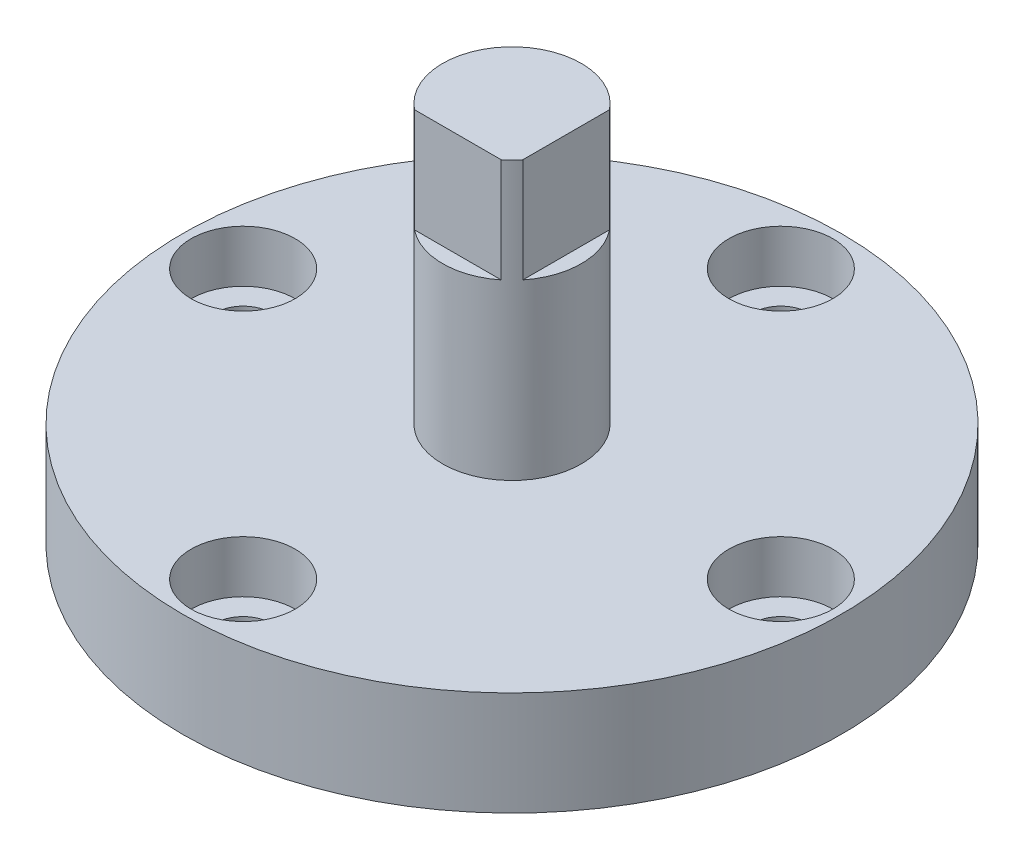
ISO-10303-21;
HEADER;
FILE_DESCRIPTION(('STEP AP214'),'2;1');
FILE_NAME('part.step','',(''),(''),'','','');
FILE_SCHEMA(('AUTOMOTIVE_DESIGN { 1 0 10303 214 1 1 1 1 }'));
ENDSEC;
DATA;
#1=APPLICATION_CONTEXT('core data for automotive mechanical design processes');
#2=APPLICATION_PROTOCOL_DEFINITION('international standard','automotive_design',2000,#1);
#3=PRODUCT_CONTEXT('',#1,'mechanical');
#4=PRODUCT('Part','Part','',(#3));
#5=PRODUCT_RELATED_PRODUCT_CATEGORY('part','',(#4));
#6=PRODUCT_DEFINITION_FORMATION('','',#4);
#7=PRODUCT_DEFINITION_CONTEXT('part definition',#1,'design');
#8=PRODUCT_DEFINITION('design','',#6,#7);
#9=PRODUCT_DEFINITION_SHAPE('','',#8);
#10=(LENGTH_UNIT() NAMED_UNIT(*) SI_UNIT(.MILLI.,.METRE.));
#11=(NAMED_UNIT(*) PLANE_ANGLE_UNIT() SI_UNIT($,.RADIAN.));
#12=(NAMED_UNIT(*) SI_UNIT($,.STERADIAN.) SOLID_ANGLE_UNIT());
#13=UNCERTAINTY_MEASURE_WITH_UNIT(LENGTH_MEASURE(1.E-05),#10,'distance_accuracy_value','');
#14=(GEOMETRIC_REPRESENTATION_CONTEXT(3) GLOBAL_UNCERTAINTY_ASSIGNED_CONTEXT((#13)) GLOBAL_UNIT_ASSIGNED_CONTEXT((#10,
#11,#12)) REPRESENTATION_CONTEXT('',''));
#15=CARTESIAN_POINT('',(0.,0.,0.));
#16=DIRECTION('',(0.,0.,1.));
#17=DIRECTION('',(1.,0.,0.));
#18=AXIS2_PLACEMENT_3D('',#15,#16,#17);
#19=CARTESIAN_POINT('',(0.,3.,0.));
#20=DIRECTION('',(0.,1.,0.));
#21=DIRECTION('',(0.,0.,1.));
#22=AXIS2_PLACEMENT_3D('',#19,#20,#21);
#23=PLANE('',#22);
#24=CARTESIAN_POINT('',(0.,3.,0.));
#25=DIRECTION('',(0.,1.,0.));
#26=DIRECTION('',(0.,0.,1.));
#27=AXIS2_PLACEMENT_3D('',#24,#25,#26);
#28=CIRCLE('',#27,4.);
#29=CARTESIAN_POINT('',(0.,3.,4.));
#30=VERTEX_POINT('',#29);
#31=EDGE_CURVE('E104',#30,#30,#28,.T.);
#32=ORIENTED_EDGE('',*,*,#31,.F.);
#33=EDGE_LOOP('',(#32));
#34=FACE_BOUND('',#33,.T.);
#35=CARTESIAN_POINT('',(0.,3.,15.5));
#36=DIRECTION('',(0.,1.,0.));
#37=DIRECTION('',(0.,0.,1.));
#38=AXIS2_PLACEMENT_3D('',#35,#36,#37);
#39=CIRCLE('',#38,3.);
#40=CARTESIAN_POINT('',(0.,3.,18.5));
#41=VERTEX_POINT('',#40);
#42=EDGE_CURVE('E139',#41,#41,#39,.T.);
#43=ORIENTED_EDGE('',*,*,#42,.F.);
#44=EDGE_LOOP('',(#43));
#45=FACE_BOUND('',#44,.T.);
#46=CARTESIAN_POINT('',(0.,3.,-15.5));
#47=DIRECTION('',(0.,1.,0.));
#48=DIRECTION('',(0.,0.,1.));
#49=AXIS2_PLACEMENT_3D('',#46,#47,#48);
#50=CIRCLE('',#49,3.);
#51=CARTESIAN_POINT('',(0.,3.,-12.5));
#52=VERTEX_POINT('',#51);
#53=EDGE_CURVE('E48',#52,#52,#50,.T.);
#54=ORIENTED_EDGE('',*,*,#53,.F.);
#55=EDGE_LOOP('',(#54));
#56=FACE_BOUND('',#55,.T.);
#57=CARTESIAN_POINT('',(0.,3.,0.));
#58=DIRECTION('',(0.,1.,0.));
#59=DIRECTION('',(0.,0.,1.));
#60=AXIS2_PLACEMENT_3D('',#57,#58,#59);
#61=CIRCLE('',#60,19.);
#62=CARTESIAN_POINT('',(0.,3.,19.));
#63=VERTEX_POINT('',#62);
#64=EDGE_CURVE('E11',#63,#63,#61,.T.);
#65=ORIENTED_EDGE('',*,*,#64,.T.);
#66=EDGE_LOOP('',(#65));
#67=FACE_BOUND('',#66,.T.);
#68=CARTESIAN_POINT('',(15.5,3.,0.));
#69=DIRECTION('',(0.,1.,0.));
#70=DIRECTION('',(0.,0.,1.));
#71=AXIS2_PLACEMENT_3D('',#68,#69,#70);
#72=CIRCLE('',#71,3.);
#73=CARTESIAN_POINT('',(15.5,3.,3.));
#74=VERTEX_POINT('',#73);
#75=EDGE_CURVE('E147',#74,#74,#72,.T.);
#76=ORIENTED_EDGE('',*,*,#75,.F.);
#77=EDGE_LOOP('',(#76));
#78=FACE_BOUND('',#77,.T.);
#79=CARTESIAN_POINT('',(-15.5,3.,0.));
#80=DIRECTION('',(0.,1.,0.));
#81=DIRECTION('',(0.,0.,1.));
#82=AXIS2_PLACEMENT_3D('',#79,#80,#81);
#83=CIRCLE('',#82,3.);
#84=CARTESIAN_POINT('',(-15.5,3.,3.));
#85=VERTEX_POINT('',#84);
#86=EDGE_CURVE('E131',#85,#85,#83,.T.);
#87=ORIENTED_EDGE('',*,*,#86,.F.);
#88=EDGE_LOOP('',(#87));
#89=FACE_BOUND('',#88,.T.);
#90=ADVANCED_FACE('F39',(#34,#45,#56,#67,#78,#89),#23,.T.);
#91=CARTESIAN_POINT('',(0.,3.,0.));
#92=DIRECTION('',(0.,-1.,0.));
#93=DIRECTION('',(0.,0.,-1.));
#94=AXIS2_PLACEMENT_3D('',#91,#92,#93);
#95=CYLINDRICAL_SURFACE('',#94,19.);
#96=ORIENTED_EDGE('',*,*,#64,.F.);
#97=EDGE_LOOP('',(#96));
#98=FACE_BOUND('',#97,.T.);
#99=CARTESIAN_POINT('',(0.,-3.,0.));
#100=DIRECTION('',(0.,-1.,0.));
#101=DIRECTION('',(0.,0.,-1.));
#102=AXIS2_PLACEMENT_3D('',#99,#100,#101);
#103=CIRCLE('',#102,19.);
#104=CARTESIAN_POINT('',(0.,-3.,-19.));
#105=VERTEX_POINT('',#104);
#106=EDGE_CURVE('E118',#105,#105,#103,.T.);
#107=ORIENTED_EDGE('',*,*,#106,.F.);
#108=EDGE_LOOP('',(#107));
#109=FACE_BOUND('',#108,.T.);
#110=ADVANCED_FACE('F41',(#98,#109),#95,.T.);
#111=CARTESIAN_POINT('',(0.,3.,-15.5));
#112=DIRECTION('',(0.,-1.,0.));
#113=DIRECTION('',(0.,0.,-1.));
#114=AXIS2_PLACEMENT_3D('',#111,#112,#113);
#115=CYLINDRICAL_SURFACE('',#114,3.);
#116=ORIENTED_EDGE('',*,*,#53,.T.);
#117=EDGE_LOOP('',(#116));
#118=FACE_BOUND('',#117,.T.);
#119=CARTESIAN_POINT('',(0.,0.,-15.5));
#120=DIRECTION('',(0.,1.,0.));
#121=DIRECTION('',(0.,0.,1.));
#122=AXIS2_PLACEMENT_3D('',#119,#120,#121);
#123=CIRCLE('',#122,3.);
#124=CARTESIAN_POINT('',(0.,0.,-12.5));
#125=VERTEX_POINT('',#124);
#126=EDGE_CURVE('E151',#125,#125,#123,.T.);
#127=ORIENTED_EDGE('',*,*,#126,.F.);
#128=EDGE_LOOP('',(#127));
#129=FACE_BOUND('',#128,.T.);
#130=ADVANCED_FACE('F163',(#118,#129),#115,.F.);
#131=CARTESIAN_POINT('',(15.5,3.,0.));
#132=DIRECTION('',(0.,-1.,0.));
#133=DIRECTION('',(0.,0.,-1.));
#134=AXIS2_PLACEMENT_3D('',#131,#132,#133);
#135=CYLINDRICAL_SURFACE('',#134,3.);
#136=ORIENTED_EDGE('',*,*,#75,.T.);
#137=EDGE_LOOP('',(#136));
#138=FACE_BOUND('',#137,.T.);
#139=CARTESIAN_POINT('',(15.5,0.,0.));
#140=DIRECTION('',(0.,1.,0.));
#141=DIRECTION('',(0.,0.,1.));
#142=AXIS2_PLACEMENT_3D('',#139,#140,#141);
#143=CIRCLE('',#142,3.);
#144=CARTESIAN_POINT('',(15.5,0.,3.));
#145=VERTEX_POINT('',#144);
#146=EDGE_CURVE('E143',#145,#145,#143,.T.);
#147=ORIENTED_EDGE('',*,*,#146,.F.);
#148=EDGE_LOOP('',(#147));
#149=FACE_BOUND('',#148,.T.);
#150=ADVANCED_FACE('F165',(#138,#149),#135,.F.);
#151=CARTESIAN_POINT('',(0.,3.,15.5));
#152=DIRECTION('',(0.,-1.,0.));
#153=DIRECTION('',(0.,0.,-1.));
#154=AXIS2_PLACEMENT_3D('',#151,#152,#153);
#155=CYLINDRICAL_SURFACE('',#154,3.);
#156=ORIENTED_EDGE('',*,*,#42,.T.);
#157=EDGE_LOOP('',(#156));
#158=FACE_BOUND('',#157,.T.);
#159=CARTESIAN_POINT('',(0.,0.,15.5));
#160=DIRECTION('',(0.,1.,0.));
#161=DIRECTION('',(0.,0.,1.));
#162=AXIS2_PLACEMENT_3D('',#159,#160,#161);
#163=CIRCLE('',#162,3.);
#164=CARTESIAN_POINT('',(0.,0.,18.5));
#165=VERTEX_POINT('',#164);
#166=EDGE_CURVE('E135',#165,#165,#163,.T.);
#167=ORIENTED_EDGE('',*,*,#166,.F.);
#168=EDGE_LOOP('',(#167));
#169=FACE_BOUND('',#168,.T.);
#170=ADVANCED_FACE('F172',(#158,#169),#155,.F.);
#171=CARTESIAN_POINT('',(-15.5,3.,0.));
#172=DIRECTION('',(0.,-1.,0.));
#173=DIRECTION('',(0.,0.,-1.));
#174=AXIS2_PLACEMENT_3D('',#171,#172,#173);
#175=CYLINDRICAL_SURFACE('',#174,3.);
#176=ORIENTED_EDGE('',*,*,#86,.T.);
#177=EDGE_LOOP('',(#176));
#178=FACE_BOUND('',#177,.T.);
#179=CARTESIAN_POINT('',(-15.5,0.,0.));
#180=DIRECTION('',(0.,1.,0.));
#181=DIRECTION('',(0.,0.,1.));
#182=AXIS2_PLACEMENT_3D('',#179,#180,#181);
#183=CIRCLE('',#182,3.);
#184=CARTESIAN_POINT('',(-15.5,0.,3.));
#185=VERTEX_POINT('',#184);
#186=EDGE_CURVE('E126',#185,#185,#183,.T.);
#187=ORIENTED_EDGE('',*,*,#186,.F.);
#188=EDGE_LOOP('',(#187));
#189=FACE_BOUND('',#188,.T.);
#190=ADVANCED_FACE('F192',(#178,#189),#175,.F.);
#191=CARTESIAN_POINT('',(0.,19.,0.));
#192=DIRECTION('',(0.,-1.,0.));
#193=DIRECTION('',(0.,0.,-1.));
#194=AXIS2_PLACEMENT_3D('',#191,#192,#193);
#195=CYLINDRICAL_SURFACE('',#194,4.);
#196=CARTESIAN_POINT('',(0.,19.,0.));
#197=DIRECTION('',(0.,1.,0.));
#198=DIRECTION('',(0.,0.,1.));
#199=AXIS2_PLACEMENT_3D('',#196,#197,#198);
#200=CIRCLE('',#199,4.);
#201=CARTESIAN_POINT('',(2.5,19.,3.1224989991992));
#202=VERTEX_POINT('',#201);
#203=CARTESIAN_POINT('',(3.1224989991992,19.,2.5));
#204=VERTEX_POINT('',#203);
#205=EDGE_CURVE('E100',#202,#204,#200,.T.);
#206=ORIENTED_EDGE('',*,*,#205,.F.);
#207=DIRECTION('',(0.,1.,0.));
#208=VECTOR('',#207,1.);
#209=CARTESIAN_POINT('',(2.5,13.,3.1224989991992));
#210=LINE('',#209,#208);
#211=CARTESIAN_POINT('',(2.5,13.,3.1224989991992));
#212=VERTEX_POINT('',#211);
#213=EDGE_CURVE('E63',#212,#202,#210,.T.);
#214=ORIENTED_EDGE('',*,*,#213,.F.);
#215=CARTESIAN_POINT('',(0.,13.,0.));
#216=DIRECTION('',(0.,1.,0.));
#217=DIRECTION('',(0.,0.,1.));
#218=AXIS2_PLACEMENT_3D('',#215,#216,#217);
#219=CIRCLE('',#218,4.);
#220=CARTESIAN_POINT('',(-2.5,13.,3.1224989991992));
#221=VERTEX_POINT('',#220);
#222=EDGE_CURVE('E83',#221,#212,#219,.T.);
#223=ORIENTED_EDGE('',*,*,#222,.F.);
#224=DIRECTION('',(0.,1.,0.));
#225=VECTOR('',#224,1.);
#226=CARTESIAN_POINT('',(-2.5,13.,3.1224989991992));
#227=LINE('',#226,#225);
#228=CARTESIAN_POINT('',(-2.5,19.,3.1224989991992));
#229=VERTEX_POINT('',#228);
#230=EDGE_CURVE('E92',#221,#229,#227,.T.);
#231=ORIENTED_EDGE('',*,*,#230,.T.);
#232=CARTESIAN_POINT('',(3.1224989991992,19.,-2.5));
#233=VERTEX_POINT('',#232);
#234=EDGE_CURVE('E127',#233,#229,#200,.T.);
#235=ORIENTED_EDGE('',*,*,#234,.F.);
#236=DIRECTION('',(0.,1.,0.));
#237=VECTOR('',#236,1.);
#238=CARTESIAN_POINT('',(3.1224989991992,13.,-2.5));
#239=LINE('',#238,#237);
#240=CARTESIAN_POINT('',(3.1224989991992,13.,-2.5));
#241=VERTEX_POINT('',#240);
#242=EDGE_CURVE('E55',#241,#233,#239,.T.);
#243=ORIENTED_EDGE('',*,*,#242,.F.);
#244=CARTESIAN_POINT('',(0.,13.,0.));
#245=DIRECTION('',(0.,1.,0.));
#246=DIRECTION('',(0.,0.,1.));
#247=AXIS2_PLACEMENT_3D('',#244,#245,#246);
#248=CIRCLE('',#247,4.00000000000001);
#249=CARTESIAN_POINT('',(3.1224989991992,13.,2.5));
#250=VERTEX_POINT('',#249);
#251=EDGE_CURVE('E108',#250,#241,#248,.T.);
#252=ORIENTED_EDGE('',*,*,#251,.F.);
#253=DIRECTION('',(0.,1.,0.));
#254=VECTOR('',#253,1.);
#255=CARTESIAN_POINT('',(3.1224989991992,13.,2.5));
#256=LINE('',#255,#254);
#257=EDGE_CURVE('E119',#250,#204,#256,.T.);
#258=ORIENTED_EDGE('',*,*,#257,.T.);
#259=EDGE_LOOP('',(#206,#214,#223,#231,#235,#243,#252,#258));
#260=FACE_BOUND('',#259,.T.);
#261=ORIENTED_EDGE('',*,*,#31,.T.);
#262=EDGE_LOOP('',(#261));
#263=FACE_BOUND('',#262,.T.);
#264=ADVANCED_FACE('F96',(#260,#263),#195,.T.);
#265=CARTESIAN_POINT('',(0.,19.,0.));
#266=DIRECTION('',(0.,1.,0.));
#267=DIRECTION('',(0.,0.,1.));
#268=AXIS2_PLACEMENT_3D('',#265,#266,#267);
#269=PLANE('',#268);
#270=DIRECTION('',(-1.,0.,0.));
#271=VECTOR('',#270,1.);
#272=CARTESIAN_POINT('',(-2.5,19.,3.1224989991992));
#273=LINE('',#272,#271);
#274=EDGE_CURVE('E89',#202,#229,#273,.T.);
#275=ORIENTED_EDGE('',*,*,#274,.F.);
#276=ORIENTED_EDGE('',*,*,#205,.T.);
#277=DIRECTION('',(0.,0.,1.));
#278=VECTOR('',#277,1.);
#279=CARTESIAN_POINT('',(3.1224989991992,19.,-2.5));
#280=LINE('',#279,#278);
#281=EDGE_CURVE('E112',#233,#204,#280,.T.);
#282=ORIENTED_EDGE('',*,*,#281,.F.);
#283=ORIENTED_EDGE('',*,*,#234,.T.);
#284=EDGE_LOOP('',(#275,#276,#282,#283));
#285=FACE_BOUND('',#284,.T.);
#286=ADVANCED_FACE('F260',(#285),#269,.T.);
#287=CARTESIAN_POINT('',(3.1224989991992,13.,-2.5));
#288=DIRECTION('',(-1.,0.,0.));
#289=DIRECTION('',(0.,0.,1.));
#290=AXIS2_PLACEMENT_3D('',#287,#288,#289);
#291=PLANE('',#290);
#292=ORIENTED_EDGE('',*,*,#281,.T.);
#293=ORIENTED_EDGE('',*,*,#257,.F.);
#294=DIRECTION('',(0.,0.,1.));
#295=VECTOR('',#294,1.);
#296=CARTESIAN_POINT('',(3.1224989991992,13.,-2.5));
#297=LINE('',#296,#295);
#298=EDGE_CURVE('E111',#241,#250,#297,.T.);
#299=ORIENTED_EDGE('',*,*,#298,.F.);
#300=ORIENTED_EDGE('',*,*,#242,.T.);
#301=EDGE_LOOP('',(#292,#293,#299,#300));
#302=FACE_BOUND('',#301,.T.);
#303=ADVANCED_FACE('F262',(#302),#291,.F.);
#304=CARTESIAN_POINT('',(0.,13.,0.));
#305=DIRECTION('',(0.,1.,0.));
#306=DIRECTION('',(0.,0.,1.));
#307=AXIS2_PLACEMENT_3D('',#304,#305,#306);
#308=PLANE('',#307);
#309=ORIENTED_EDGE('',*,*,#251,.T.);
#310=ORIENTED_EDGE('',*,*,#298,.T.);
#311=EDGE_LOOP('',(#309,#310));
#312=FACE_BOUND('',#311,.T.);
#313=ADVANCED_FACE('F265',(#312),#308,.T.);
#314=CARTESIAN_POINT('',(-2.5,13.,3.1224989991992));
#315=DIRECTION('',(0.,0.,-1.));
#316=DIRECTION('',(-1.,0.,0.));
#317=AXIS2_PLACEMENT_3D('',#314,#315,#316);
#318=PLANE('',#317);
#319=ORIENTED_EDGE('',*,*,#274,.T.);
#320=ORIENTED_EDGE('',*,*,#230,.F.);
#321=DIRECTION('',(-1.,0.,0.));
#322=VECTOR('',#321,1.);
#323=CARTESIAN_POINT('',(-2.5,13.,3.1224989991992));
#324=LINE('',#323,#322);
#325=EDGE_CURVE('E85',#212,#221,#324,.T.);
#326=ORIENTED_EDGE('',*,*,#325,.F.);
#327=ORIENTED_EDGE('',*,*,#213,.T.);
#328=EDGE_LOOP('',(#319,#320,#326,#327));
#329=FACE_BOUND('',#328,.T.);
#330=ADVANCED_FACE('F91',(#329),#318,.F.);
#331=CARTESIAN_POINT('',(0.,13.,0.));
#332=DIRECTION('',(0.,1.,0.));
#333=DIRECTION('',(0.,0.,1.));
#334=AXIS2_PLACEMENT_3D('',#331,#332,#333);
#335=PLANE('',#334);
#336=ORIENTED_EDGE('',*,*,#222,.T.);
#337=ORIENTED_EDGE('',*,*,#325,.T.);
#338=EDGE_LOOP('',(#336,#337));
#339=FACE_BOUND('',#338,.T.);
#340=ADVANCED_FACE('F84',(#339),#335,.T.);
#341=CARTESIAN_POINT('',(0.,0.,0.));
#342=DIRECTION('',(0.,-1.,0.));
#343=DIRECTION('',(0.,0.,-1.));
#344=AXIS2_PLACEMENT_3D('',#341,#342,#343);
#345=PLANE('',#344);
#346=CARTESIAN_POINT('',(0.,0.,-15.5));
#347=DIRECTION('',(0.,-1.,0.));
#348=DIRECTION('',(0.,0.,-1.));
#349=AXIS2_PLACEMENT_3D('',#346,#347,#348);
#350=CIRCLE('',#349,1.6);
#351=CARTESIAN_POINT('',(0.,0.,-17.1));
#352=VERTEX_POINT('',#351);
#353=EDGE_CURVE('E224',#352,#352,#350,.T.);
#354=ORIENTED_EDGE('',*,*,#353,.T.);
#355=EDGE_LOOP('',(#354));
#356=FACE_BOUND('',#355,.T.);
#357=ORIENTED_EDGE('',*,*,#126,.T.);
#358=EDGE_LOOP('',(#357));
#359=FACE_BOUND('',#358,.T.);
#360=ADVANCED_FACE('F161',(#356,#359),#345,.F.);
#361=CARTESIAN_POINT('',(15.5,0.,0.));
#362=DIRECTION('',(0.,-1.,0.));
#363=DIRECTION('',(0.,0.,-1.));
#364=AXIS2_PLACEMENT_3D('',#361,#362,#363);
#365=CIRCLE('',#364,1.6);
#366=CARTESIAN_POINT('',(15.5,0.,-1.6));
#367=VERTEX_POINT('',#366);
#368=EDGE_CURVE('E236',#367,#367,#365,.T.);
#369=ORIENTED_EDGE('',*,*,#368,.T.);
#370=EDGE_LOOP('',(#369));
#371=FACE_BOUND('',#370,.T.);
#372=ORIENTED_EDGE('',*,*,#146,.T.);
#373=EDGE_LOOP('',(#372));
#374=FACE_BOUND('',#373,.T.);
#375=ADVANCED_FACE('F211',(#371,#374),#345,.F.);
#376=CARTESIAN_POINT('',(0.,0.,15.5));
#377=DIRECTION('',(0.,-1.,0.));
#378=DIRECTION('',(0.,0.,-1.));
#379=AXIS2_PLACEMENT_3D('',#376,#377,#378);
#380=CIRCLE('',#379,1.6);
#381=CARTESIAN_POINT('',(0.,0.,13.9));
#382=VERTEX_POINT('',#381);
#383=EDGE_CURVE('E244',#382,#382,#380,.T.);
#384=ORIENTED_EDGE('',*,*,#383,.T.);
#385=EDGE_LOOP('',(#384));
#386=FACE_BOUND('',#385,.T.);
#387=ORIENTED_EDGE('',*,*,#166,.T.);
#388=EDGE_LOOP('',(#387));
#389=FACE_BOUND('',#388,.T.);
#390=ADVANCED_FACE('F201',(#386,#389),#345,.F.);
#391=CARTESIAN_POINT('',(-15.5,0.,0.));
#392=DIRECTION('',(0.,-1.,0.));
#393=DIRECTION('',(0.,0.,-1.));
#394=AXIS2_PLACEMENT_3D('',#391,#392,#393);
#395=CIRCLE('',#394,1.6);
#396=CARTESIAN_POINT('',(-15.5,0.,-1.6));
#397=VERTEX_POINT('',#396);
#398=EDGE_CURVE('E233',#397,#397,#395,.T.);
#399=ORIENTED_EDGE('',*,*,#398,.T.);
#400=EDGE_LOOP('',(#399));
#401=FACE_BOUND('',#400,.T.);
#402=ORIENTED_EDGE('',*,*,#186,.T.);
#403=EDGE_LOOP('',(#402));
#404=FACE_BOUND('',#403,.T.);
#405=ADVANCED_FACE('F198',(#401,#404),#345,.F.);
#406=CARTESIAN_POINT('',(0.,-3.,0.));
#407=DIRECTION('',(0.,-1.,0.));
#408=DIRECTION('',(0.,0.,-1.));
#409=AXIS2_PLACEMENT_3D('',#406,#407,#408);
#410=PLANE('',#409);
#411=CARTESIAN_POINT('',(0.,-3.,-15.5));
#412=DIRECTION('',(0.,-1.,0.));
#413=DIRECTION('',(0.,0.,-1.));
#414=AXIS2_PLACEMENT_3D('',#411,#412,#413);
#415=CIRCLE('',#414,1.6);
#416=CARTESIAN_POINT('',(0.,-3.,-17.1));
#417=VERTEX_POINT('',#416);
#418=EDGE_CURVE('E227',#417,#417,#415,.T.);
#419=ORIENTED_EDGE('',*,*,#418,.F.);
#420=EDGE_LOOP('',(#419));
#421=FACE_BOUND('',#420,.T.);
#422=CARTESIAN_POINT('',(0.,-3.,15.5));
#423=DIRECTION('',(0.,-1.,0.));
#424=DIRECTION('',(0.,0.,-1.));
#425=AXIS2_PLACEMENT_3D('',#422,#423,#424);
#426=CIRCLE('',#425,1.6);
#427=CARTESIAN_POINT('',(0.,-3.,13.9));
#428=VERTEX_POINT('',#427);
#429=EDGE_CURVE('E247',#428,#428,#426,.T.);
#430=ORIENTED_EDGE('',*,*,#429,.F.);
#431=EDGE_LOOP('',(#430));
#432=FACE_BOUND('',#431,.T.);
#433=ORIENTED_EDGE('',*,*,#106,.T.);
#434=EDGE_LOOP('',(#433));
#435=FACE_BOUND('',#434,.T.);
#436=CARTESIAN_POINT('',(-15.5,-3.,0.));
#437=DIRECTION('',(0.,-1.,0.));
#438=DIRECTION('',(0.,0.,-1.));
#439=AXIS2_PLACEMENT_3D('',#436,#437,#438);
#440=CIRCLE('',#439,1.6);
#441=CARTESIAN_POINT('',(-15.5,-3.,-1.6));
#442=VERTEX_POINT('',#441);
#443=EDGE_CURVE('E240',#442,#442,#440,.T.);
#444=ORIENTED_EDGE('',*,*,#443,.F.);
#445=EDGE_LOOP('',(#444));
#446=FACE_BOUND('',#445,.T.);
#447=CARTESIAN_POINT('',(15.5,-3.,0.));
#448=DIRECTION('',(0.,-1.,0.));
#449=DIRECTION('',(0.,0.,-1.));
#450=AXIS2_PLACEMENT_3D('',#447,#448,#449);
#451=CIRCLE('',#450,1.6);
#452=CARTESIAN_POINT('',(15.5,-3.,-1.6));
#453=VERTEX_POINT('',#452);
#454=EDGE_CURVE('E228',#453,#453,#451,.T.);
#455=ORIENTED_EDGE('',*,*,#454,.F.);
#456=EDGE_LOOP('',(#455));
#457=FACE_BOUND('',#456,.T.);
#458=ADVANCED_FACE('F200',(#421,#432,#435,#446,#457),#410,.T.);
#459=CARTESIAN_POINT('',(0.,-3.,15.5));
#460=DIRECTION('',(0.,1.,0.));
#461=DIRECTION('',(0.,0.,1.));
#462=AXIS2_PLACEMENT_3D('',#459,#460,#461);
#463=CYLINDRICAL_SURFACE('',#462,1.6);
#464=ORIENTED_EDGE('',*,*,#429,.T.);
#465=EDGE_LOOP('',(#464));
#466=FACE_BOUND('',#465,.T.);
#467=ORIENTED_EDGE('',*,*,#383,.F.);
#468=EDGE_LOOP('',(#467));
#469=FACE_BOUND('',#468,.T.);
#470=ADVANCED_FACE('F208',(#466,#469),#463,.F.);
#471=CARTESIAN_POINT('',(-15.5,-3.,0.));
#472=DIRECTION('',(0.,1.,0.));
#473=DIRECTION('',(0.,0.,1.));
#474=AXIS2_PLACEMENT_3D('',#471,#472,#473);
#475=CYLINDRICAL_SURFACE('',#474,1.6);
#476=ORIENTED_EDGE('',*,*,#443,.T.);
#477=EDGE_LOOP('',(#476));
#478=FACE_BOUND('',#477,.T.);
#479=ORIENTED_EDGE('',*,*,#398,.F.);
#480=EDGE_LOOP('',(#479));
#481=FACE_BOUND('',#480,.T.);
#482=ADVANCED_FACE('F362',(#478,#481),#475,.F.);
#483=CARTESIAN_POINT('',(0.,-3.,-15.5));
#484=DIRECTION('',(0.,1.,0.));
#485=DIRECTION('',(0.,0.,1.));
#486=AXIS2_PLACEMENT_3D('',#483,#484,#485);
#487=CYLINDRICAL_SURFACE('',#486,1.6);
#488=ORIENTED_EDGE('',*,*,#418,.T.);
#489=EDGE_LOOP('',(#488));
#490=FACE_BOUND('',#489,.T.);
#491=ORIENTED_EDGE('',*,*,#353,.F.);
#492=EDGE_LOOP('',(#491));
#493=FACE_BOUND('',#492,.T.);
#494=ADVANCED_FACE('F372',(#490,#493),#487,.F.);
#495=CARTESIAN_POINT('',(15.5,-3.,0.));
#496=DIRECTION('',(0.,1.,0.));
#497=DIRECTION('',(0.,0.,1.));
#498=AXIS2_PLACEMENT_3D('',#495,#496,#497);
#499=CYLINDRICAL_SURFACE('',#498,1.6);
#500=ORIENTED_EDGE('',*,*,#454,.T.);
#501=EDGE_LOOP('',(#500));
#502=FACE_BOUND('',#501,.T.);
#503=ORIENTED_EDGE('',*,*,#368,.F.);
#504=EDGE_LOOP('',(#503));
#505=FACE_BOUND('',#504,.T.);
#506=ADVANCED_FACE('F382',(#502,#505),#499,.F.);
#507=CLOSED_SHELL('',(#90,#110,#130,#150,#170,#190,#264,#286,#303,#313,#330,#340,#360,#375,#390,
#405,#458,#470,#482,#494,#506));
#508=MANIFOLD_SOLID_BREP('B2',#507);
#509=ADVANCED_BREP_SHAPE_REPRESENTATION('',(#18,#508),#14);
#510=SHAPE_DEFINITION_REPRESENTATION(#9,#509);
ENDSEC;
END-ISO-10303-21;
